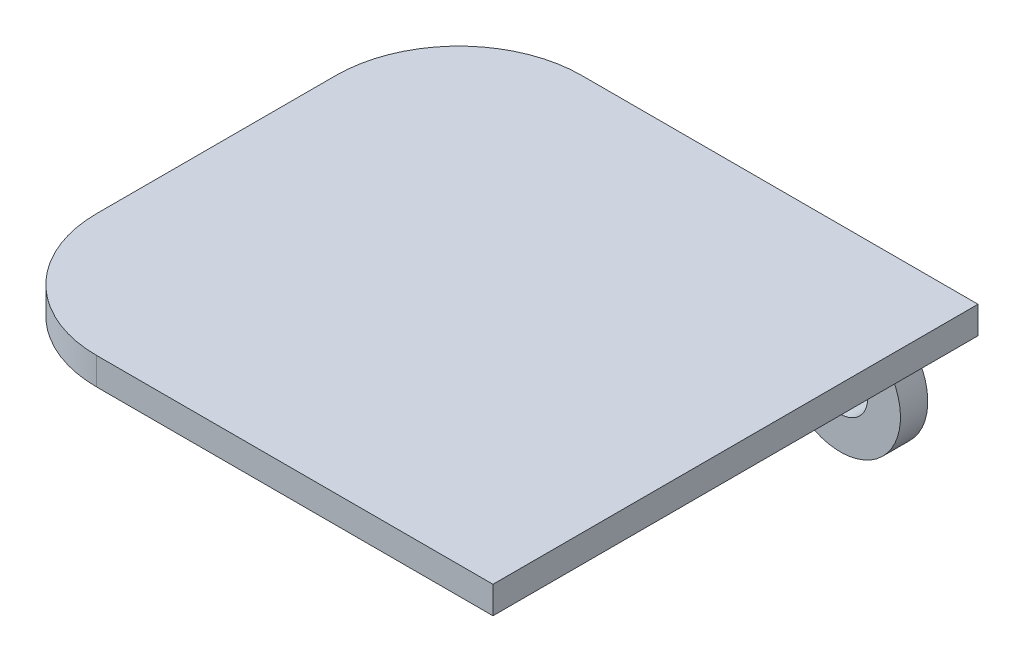
ISO-10303-21;
HEADER;
FILE_DESCRIPTION(('STEP AP214'),'2;1');
FILE_NAME('part.step','',(''),(''),'','','');
FILE_SCHEMA(('AUTOMOTIVE_DESIGN { 1 0 10303 214 1 1 1 1 }'));
ENDSEC;
DATA;
#1=APPLICATION_CONTEXT('core data for automotive mechanical design processes');
#2=APPLICATION_PROTOCOL_DEFINITION('international standard','automotive_design',2000,#1);
#3=PRODUCT_CONTEXT('',#1,'mechanical');
#4=PRODUCT('Part','Part','',(#3));
#5=PRODUCT_RELATED_PRODUCT_CATEGORY('part','',(#4));
#6=PRODUCT_DEFINITION_FORMATION('','',#4);
#7=PRODUCT_DEFINITION_CONTEXT('part definition',#1,'design');
#8=PRODUCT_DEFINITION('design','',#6,#7);
#9=PRODUCT_DEFINITION_SHAPE('','',#8);
#10=(LENGTH_UNIT() NAMED_UNIT(*) SI_UNIT(.MILLI.,.METRE.));
#11=(NAMED_UNIT(*) PLANE_ANGLE_UNIT() SI_UNIT($,.RADIAN.));
#12=(NAMED_UNIT(*) SI_UNIT($,.STERADIAN.) SOLID_ANGLE_UNIT());
#13=UNCERTAINTY_MEASURE_WITH_UNIT(LENGTH_MEASURE(1.E-05),#10,'distance_accuracy_value','');
#14=(GEOMETRIC_REPRESENTATION_CONTEXT(3) GLOBAL_UNCERTAINTY_ASSIGNED_CONTEXT((#13)) GLOBAL_UNIT_ASSIGNED_CONTEXT((#10,
#11,#12)) REPRESENTATION_CONTEXT('',''));
#15=CARTESIAN_POINT('',(0.,0.,0.));
#16=DIRECTION('',(0.,0.,1.));
#17=DIRECTION('',(1.,0.,0.));
#18=AXIS2_PLACEMENT_3D('',#15,#16,#17);
#19=CARTESIAN_POINT('',(-10.,0.,8.74999999999999));
#20=DIRECTION('',(0.,1.,0.));
#21=DIRECTION('',(0.,0.,1.));
#22=AXIS2_PLACEMENT_3D('',#19,#20,#21);
#23=PLANE('',#22);
#24=DIRECTION('',(0.,0.,-1.));
#25=VECTOR('',#24,1.);
#26=CARTESIAN_POINT('',(-3.50000000000001,0.,-15.75));
#27=LINE('',#26,#25);
#28=CARTESIAN_POINT('',(-3.50000000000001,0.,-15.75));
#29=VERTEX_POINT('',#28);
#30=CARTESIAN_POINT('',(-3.50000000000001,0.,-17.75));
#31=VERTEX_POINT('',#30);
#32=EDGE_CURVE('E133',#29,#31,#27,.T.);
#33=ORIENTED_EDGE('',*,*,#32,.F.);
#34=DIRECTION('',(1.,0.,0.));
#35=VECTOR('',#34,1.);
#36=CARTESIAN_POINT('',(10.5,0.,-15.75));
#37=LINE('',#36,#35);
#38=CARTESIAN_POINT('',(10.5,0.,-15.75));
#39=VERTEX_POINT('',#38);
#40=EDGE_CURVE('E174',#29,#39,#37,.T.);
#41=ORIENTED_EDGE('',*,*,#40,.T.);
#42=DIRECTION('',(0.,0.,-1.));
#43=VECTOR('',#42,1.);
#44=CARTESIAN_POINT('',(10.5,0.,-15.75));
#45=LINE('',#44,#43);
#46=CARTESIAN_POINT('',(10.5,0.,-17.75));
#47=VERTEX_POINT('',#46);
#48=EDGE_CURVE('E161',#39,#47,#45,.T.);
#49=ORIENTED_EDGE('',*,*,#48,.T.);
#50=DIRECTION('',(-1.,0.,0.));
#51=VECTOR('',#50,1.);
#52=CARTESIAN_POINT('',(-10.,0.,-17.75));
#53=LINE('',#52,#51);
#54=CARTESIAN_POINT('',(19.,0.,-17.75));
#55=VERTEX_POINT('',#54);
#56=EDGE_CURVE('E134',#55,#47,#53,.T.);
#57=ORIENTED_EDGE('',*,*,#56,.F.);
#58=DIRECTION('',(0.,0.,-1.));
#59=VECTOR('',#58,1.);
#60=CARTESIAN_POINT('',(19.,0.,-17.75));
#61=LINE('',#60,#59);
#62=CARTESIAN_POINT('',(19.,0.,17.75));
#63=VERTEX_POINT('',#62);
#64=EDGE_CURVE('E129',#63,#55,#61,.T.);
#65=ORIENTED_EDGE('',*,*,#64,.F.);
#66=DIRECTION('',(1.,0.,0.));
#67=VECTOR('',#66,1.);
#68=CARTESIAN_POINT('',(-9.99999999999999,0.,17.75));
#69=LINE('',#68,#67);
#70=CARTESIAN_POINT('',(-9.99999999999999,0.,17.75));
#71=VERTEX_POINT('',#70);
#72=EDGE_CURVE('E83',#71,#63,#69,.T.);
#73=ORIENTED_EDGE('',*,*,#72,.F.);
#74=CARTESIAN_POINT('',(-10.,0.,8.74999999999999));
#75=DIRECTION('',(0.,1.,0.));
#76=DIRECTION('',(0.,0.,1.));
#77=AXIS2_PLACEMENT_3D('',#74,#75,#76);
#78=CIRCLE('',#77,9.);
#79=CARTESIAN_POINT('',(-19.,0.,8.74999999999999));
#80=VERTEX_POINT('',#79);
#81=EDGE_CURVE('E140',#80,#71,#78,.T.);
#82=ORIENTED_EDGE('',*,*,#81,.F.);
#83=DIRECTION('',(0.,0.,1.));
#84=VECTOR('',#83,1.);
#85=CARTESIAN_POINT('',(-19.,0.,-8.75));
#86=LINE('',#85,#84);
#87=CARTESIAN_POINT('',(-19.,0.,-8.75));
#88=VERTEX_POINT('',#87);
#89=EDGE_CURVE('E117',#88,#80,#86,.T.);
#90=ORIENTED_EDGE('',*,*,#89,.F.);
#91=CARTESIAN_POINT('',(-10.,0.,-8.75));
#92=DIRECTION('',(0.,1.,0.));
#93=DIRECTION('',(0.,0.,1.));
#94=AXIS2_PLACEMENT_3D('',#91,#92,#93);
#95=CIRCLE('',#94,9.);
#96=CARTESIAN_POINT('',(-10.,0.,-17.75));
#97=VERTEX_POINT('',#96);
#98=EDGE_CURVE('E137',#97,#88,#95,.T.);
#99=ORIENTED_EDGE('',*,*,#98,.F.);
#100=EDGE_CURVE('E132',#31,#97,#53,.T.);
#101=ORIENTED_EDGE('',*,*,#100,.F.);
#102=EDGE_LOOP('',(#33,#41,#49,#57,#65,#73,#82,#90,#99,#101));
#103=FACE_BOUND('',#102,.T.);
#104=ADVANCED_FACE('F32',(#103),#23,.F.);
#105=CARTESIAN_POINT('',(19.,2.,-17.75));
#106=DIRECTION('',(-1.,0.,0.));
#107=DIRECTION('',(0.,0.,1.));
#108=AXIS2_PLACEMENT_3D('',#105,#106,#107);
#109=PLANE('',#108);
#110=ORIENTED_EDGE('',*,*,#64,.T.);
#111=DIRECTION('',(0.,-1.,0.));
#112=VECTOR('',#111,1.);
#113=CARTESIAN_POINT('',(19.,2.,-17.75));
#114=LINE('',#113,#112);
#115=CARTESIAN_POINT('',(19.,2.,-17.75));
#116=VERTEX_POINT('',#115);
#117=EDGE_CURVE('E11',#116,#55,#114,.T.);
#118=ORIENTED_EDGE('',*,*,#117,.F.);
#119=DIRECTION('',(0.,0.,-1.));
#120=VECTOR('',#119,1.);
#121=CARTESIAN_POINT('',(19.,2.,-17.75));
#122=LINE('',#121,#120);
#123=CARTESIAN_POINT('',(19.,2.,17.75));
#124=VERTEX_POINT('',#123);
#125=EDGE_CURVE('E143',#124,#116,#122,.T.);
#126=ORIENTED_EDGE('',*,*,#125,.F.);
#127=DIRECTION('',(0.,-1.,0.));
#128=VECTOR('',#127,1.);
#129=CARTESIAN_POINT('',(19.,2.,17.75));
#130=LINE('',#129,#128);
#131=EDGE_CURVE('E125',#124,#63,#130,.T.);
#132=ORIENTED_EDGE('',*,*,#131,.T.);
#133=EDGE_LOOP('',(#110,#118,#126,#132));
#134=FACE_BOUND('',#133,.T.);
#135=ADVANCED_FACE('F34',(#134),#109,.F.);
#136=CARTESIAN_POINT('',(-10.,2.,-17.75));
#137=DIRECTION('',(0.,0.,1.));
#138=DIRECTION('',(1.,0.,0.));
#139=AXIS2_PLACEMENT_3D('',#136,#137,#138);
#140=PLANE('',#139);
#141=ORIENTED_EDGE('',*,*,#56,.T.);
#142=DIRECTION('',(0.777751862218068,-0.628571428571429,0.));
#143=VECTOR('',#142,1.);
#144=CARTESIAN_POINT('',(10.5,0.,-17.75));
#145=LINE('',#144,#143);
#146=CARTESIAN_POINT('',(13.6897093341595,-2.5778918062405,-17.75));
#147=VERTEX_POINT('',#146);
#148=EDGE_CURVE('E47',#47,#147,#145,.T.);
#149=ORIENTED_EDGE('',*,*,#148,.T.);
#150=CARTESIAN_POINT('',(10.9239950484452,-6.,-17.75));
#151=DIRECTION('',(0.,0.,-1.));
#152=DIRECTION('',(1.,0.,0.));
#153=AXIS2_PLACEMENT_3D('',#150,#151,#152);
#154=CIRCLE('',#153,4.4);
#155=CARTESIAN_POINT('',(8.1582807627309,-9.4221081937595,-17.75));
#156=VERTEX_POINT('',#155);
#157=EDGE_CURVE('E175',#147,#156,#154,.T.);
#158=ORIENTED_EDGE('',*,*,#157,.T.);
#159=DIRECTION('',(-0.777751862218068,0.628571428571429,0.));
#160=VECTOR('',#159,1.);
#161=CARTESIAN_POINT('',(8.1582807627309,-9.4221081937595,-17.75));
#162=LINE('',#161,#160);
#163=EDGE_CURVE('E171',#156,#31,#162,.T.);
#164=ORIENTED_EDGE('',*,*,#163,.T.);
#165=ORIENTED_EDGE('',*,*,#100,.T.);
#166=DIRECTION('',(0.,-1.,0.));
#167=VECTOR('',#166,1.);
#168=CARTESIAN_POINT('',(-10.,2.,-17.75));
#169=LINE('',#168,#167);
#170=CARTESIAN_POINT('',(-10.,2.,-17.75));
#171=VERTEX_POINT('',#170);
#172=EDGE_CURVE('E40',#171,#97,#169,.T.);
#173=ORIENTED_EDGE('',*,*,#172,.F.);
#174=DIRECTION('',(-1.,0.,0.));
#175=VECTOR('',#174,1.);
#176=CARTESIAN_POINT('',(-10.,2.,-17.75));
#177=LINE('',#176,#175);
#178=EDGE_CURVE('E91',#116,#171,#177,.T.);
#179=ORIENTED_EDGE('',*,*,#178,.F.);
#180=ORIENTED_EDGE('',*,*,#117,.T.);
#181=EDGE_LOOP('',(#141,#149,#158,#164,#165,#173,#179,#180));
#182=FACE_BOUND('',#181,.T.);
#183=CARTESIAN_POINT('',(10.9239950484452,-6.,-17.75));
#184=DIRECTION('',(0.,0.,-1.));
#185=DIRECTION('',(-1.,0.,0.));
#186=AXIS2_PLACEMENT_3D('',#183,#184,#185);
#187=CIRCLE('',#186,2.);
#188=CARTESIAN_POINT('',(8.92399504844518,-6.,-17.75));
#189=VERTEX_POINT('',#188);
#190=EDGE_CURVE('E190',#189,#189,#187,.T.);
#191=ORIENTED_EDGE('',*,*,#190,.F.);
#192=EDGE_LOOP('',(#191));
#193=FACE_BOUND('',#192,.T.);
#194=ADVANCED_FACE('F205',(#182,#193),#140,.F.);
#195=CARTESIAN_POINT('',(-10.,2.,-8.75));
#196=DIRECTION('',(0.,-1.,0.));
#197=DIRECTION('',(0.,0.,-1.));
#198=AXIS2_PLACEMENT_3D('',#195,#196,#197);
#199=CYLINDRICAL_SURFACE('',#198,9.);
#200=ORIENTED_EDGE('',*,*,#98,.T.);
#201=DIRECTION('',(0.,-1.,0.));
#202=VECTOR('',#201,1.);
#203=CARTESIAN_POINT('',(-19.,2.,-8.75));
#204=LINE('',#203,#202);
#205=CARTESIAN_POINT('',(-19.,2.,-8.75));
#206=VERTEX_POINT('',#205);
#207=EDGE_CURVE('E120',#206,#88,#204,.T.);
#208=ORIENTED_EDGE('',*,*,#207,.F.);
#209=CARTESIAN_POINT('',(-10.,2.,-8.75));
#210=DIRECTION('',(0.,1.,0.));
#211=DIRECTION('',(0.,0.,1.));
#212=AXIS2_PLACEMENT_3D('',#209,#210,#211);
#213=CIRCLE('',#212,9.);
#214=EDGE_CURVE('E108',#171,#206,#213,.T.);
#215=ORIENTED_EDGE('',*,*,#214,.F.);
#216=ORIENTED_EDGE('',*,*,#172,.T.);
#217=EDGE_LOOP('',(#200,#208,#215,#216));
#218=FACE_BOUND('',#217,.T.);
#219=ADVANCED_FACE('F149',(#218),#199,.T.);
#220=CARTESIAN_POINT('',(-19.,2.,-8.75));
#221=DIRECTION('',(1.,0.,0.));
#222=DIRECTION('',(0.,0.,-1.));
#223=AXIS2_PLACEMENT_3D('',#220,#221,#222);
#224=PLANE('',#223);
#225=ORIENTED_EDGE('',*,*,#89,.T.);
#226=DIRECTION('',(0.,-1.,0.));
#227=VECTOR('',#226,1.);
#228=CARTESIAN_POINT('',(-19.,2.,8.74999999999999));
#229=LINE('',#228,#227);
#230=CARTESIAN_POINT('',(-19.,2.,8.74999999999999));
#231=VERTEX_POINT('',#230);
#232=EDGE_CURVE('E114',#231,#80,#229,.T.);
#233=ORIENTED_EDGE('',*,*,#232,.F.);
#234=DIRECTION('',(0.,0.,1.));
#235=VECTOR('',#234,1.);
#236=CARTESIAN_POINT('',(-19.,2.,-8.75));
#237=LINE('',#236,#235);
#238=EDGE_CURVE('E101',#206,#231,#237,.T.);
#239=ORIENTED_EDGE('',*,*,#238,.F.);
#240=ORIENTED_EDGE('',*,*,#207,.T.);
#241=EDGE_LOOP('',(#225,#233,#239,#240));
#242=FACE_BOUND('',#241,.T.);
#243=ADVANCED_FACE('F115',(#242),#224,.F.);
#244=CARTESIAN_POINT('',(-10.,2.,8.74999999999999));
#245=DIRECTION('',(0.,-1.,0.));
#246=DIRECTION('',(0.,0.,-1.));
#247=AXIS2_PLACEMENT_3D('',#244,#245,#246);
#248=CYLINDRICAL_SURFACE('',#247,9.);
#249=ORIENTED_EDGE('',*,*,#81,.T.);
#250=DIRECTION('',(0.,-1.,0.));
#251=VECTOR('',#250,1.);
#252=CARTESIAN_POINT('',(-9.99999999999999,2.,17.75));
#253=LINE('',#252,#251);
#254=CARTESIAN_POINT('',(-9.99999999999999,2.,17.75));
#255=VERTEX_POINT('',#254);
#256=EDGE_CURVE('E121',#255,#71,#253,.T.);
#257=ORIENTED_EDGE('',*,*,#256,.F.);
#258=CARTESIAN_POINT('',(-10.,2.,8.74999999999999));
#259=DIRECTION('',(0.,1.,0.));
#260=DIRECTION('',(0.,0.,1.));
#261=AXIS2_PLACEMENT_3D('',#258,#259,#260);
#262=CIRCLE('',#261,9.);
#263=EDGE_CURVE('E105',#231,#255,#262,.T.);
#264=ORIENTED_EDGE('',*,*,#263,.F.);
#265=ORIENTED_EDGE('',*,*,#232,.T.);
#266=EDGE_LOOP('',(#249,#257,#264,#265));
#267=FACE_BOUND('',#266,.T.);
#268=ADVANCED_FACE('F123',(#267),#248,.T.);
#269=CARTESIAN_POINT('',(-9.99999999999999,2.,17.75));
#270=DIRECTION('',(0.,0.,-1.));
#271=DIRECTION('',(-1.,0.,0.));
#272=AXIS2_PLACEMENT_3D('',#269,#270,#271);
#273=PLANE('',#272);
#274=ORIENTED_EDGE('',*,*,#72,.T.);
#275=ORIENTED_EDGE('',*,*,#131,.F.);
#276=DIRECTION('',(1.,0.,0.));
#277=VECTOR('',#276,1.);
#278=CARTESIAN_POINT('',(-9.99999999999999,2.,17.75));
#279=LINE('',#278,#277);
#280=EDGE_CURVE('E56',#255,#124,#279,.T.);
#281=ORIENTED_EDGE('',*,*,#280,.F.);
#282=ORIENTED_EDGE('',*,*,#256,.T.);
#283=EDGE_LOOP('',(#274,#275,#281,#282));
#284=FACE_BOUND('',#283,.T.);
#285=ADVANCED_FACE('F154',(#284),#273,.F.);
#286=CARTESIAN_POINT('',(-10.,2.,8.74999999999999));
#287=DIRECTION('',(0.,1.,0.));
#288=DIRECTION('',(0.,0.,1.));
#289=AXIS2_PLACEMENT_3D('',#286,#287,#288);
#290=PLANE('',#289);
#291=ORIENTED_EDGE('',*,*,#125,.T.);
#292=ORIENTED_EDGE('',*,*,#178,.T.);
#293=ORIENTED_EDGE('',*,*,#214,.T.);
#294=ORIENTED_EDGE('',*,*,#238,.T.);
#295=ORIENTED_EDGE('',*,*,#263,.T.);
#296=ORIENTED_EDGE('',*,*,#280,.T.);
#297=EDGE_LOOP('',(#291,#292,#293,#294,#295,#296));
#298=FACE_BOUND('',#297,.T.);
#299=ADVANCED_FACE('F103',(#298),#290,.T.);
#300=CARTESIAN_POINT('',(8.1582807627309,-9.4221081937595,-15.75));
#301=DIRECTION('',(-0.628571428571429,-0.777751862218068,0.));
#302=DIRECTION('',(0.777751862218068,-0.628571428571429,0.));
#303=AXIS2_PLACEMENT_3D('',#300,#301,#302);
#304=PLANE('',#303);
#305=ORIENTED_EDGE('',*,*,#163,.F.);
#306=DIRECTION('',(0.,0.,-1.));
#307=VECTOR('',#306,1.);
#308=CARTESIAN_POINT('',(8.1582807627309,-9.4221081937595,-15.75));
#309=LINE('',#308,#307);
#310=CARTESIAN_POINT('',(8.1582807627309,-9.4221081937595,-15.75));
#311=VERTEX_POINT('',#310);
#312=EDGE_CURVE('E166',#311,#156,#309,.T.);
#313=ORIENTED_EDGE('',*,*,#312,.F.);
#314=DIRECTION('',(-0.777751862218068,0.628571428571429,0.));
#315=VECTOR('',#314,1.);
#316=CARTESIAN_POINT('',(8.1582807627309,-9.4221081937595,-15.75));
#317=LINE('',#316,#315);
#318=EDGE_CURVE('E164',#311,#29,#317,.T.);
#319=ORIENTED_EDGE('',*,*,#318,.T.);
#320=ORIENTED_EDGE('',*,*,#32,.T.);
#321=EDGE_LOOP('',(#305,#313,#319,#320));
#322=FACE_BOUND('',#321,.T.);
#323=ADVANCED_FACE('F242',(#322),#304,.T.);
#324=CARTESIAN_POINT('',(10.9239950484452,-6.,-15.75));
#325=DIRECTION('',(0.,0.,-1.));
#326=DIRECTION('',(-1.,0.,0.));
#327=AXIS2_PLACEMENT_3D('',#324,#325,#326);
#328=CYLINDRICAL_SURFACE('',#327,4.4);
#329=ORIENTED_EDGE('',*,*,#157,.F.);
#330=DIRECTION('',(0.,0.,-1.));
#331=VECTOR('',#330,1.);
#332=CARTESIAN_POINT('',(13.6897093341595,-2.5778918062405,-15.75));
#333=LINE('',#332,#331);
#334=CARTESIAN_POINT('',(13.6897093341595,-2.5778918062405,-15.75));
#335=VERTEX_POINT('',#334);
#336=EDGE_CURVE('E163',#335,#147,#333,.T.);
#337=ORIENTED_EDGE('',*,*,#336,.F.);
#338=CARTESIAN_POINT('',(10.9239950484452,-6.,-15.75));
#339=DIRECTION('',(0.,0.,-1.));
#340=DIRECTION('',(1.,0.,0.));
#341=AXIS2_PLACEMENT_3D('',#338,#339,#340);
#342=CIRCLE('',#341,4.4);
#343=EDGE_CURVE('E182',#335,#311,#342,.T.);
#344=ORIENTED_EDGE('',*,*,#343,.T.);
#345=ORIENTED_EDGE('',*,*,#312,.T.);
#346=EDGE_LOOP('',(#329,#337,#344,#345));
#347=FACE_BOUND('',#346,.T.);
#348=ADVANCED_FACE('F248',(#347),#328,.T.);
#349=CARTESIAN_POINT('',(10.5,0.,-15.75));
#350=DIRECTION('',(0.628571428571429,0.777751862218068,0.));
#351=DIRECTION('',(-0.777751862218068,0.628571428571429,0.));
#352=AXIS2_PLACEMENT_3D('',#349,#350,#351);
#353=PLANE('',#352);
#354=ORIENTED_EDGE('',*,*,#148,.F.);
#355=ORIENTED_EDGE('',*,*,#48,.F.);
#356=DIRECTION('',(0.777751862218068,-0.628571428571429,0.));
#357=VECTOR('',#356,1.);
#358=CARTESIAN_POINT('',(10.5,0.,-15.75));
#359=LINE('',#358,#357);
#360=EDGE_CURVE('E185',#39,#335,#359,.T.);
#361=ORIENTED_EDGE('',*,*,#360,.T.);
#362=ORIENTED_EDGE('',*,*,#336,.T.);
#363=EDGE_LOOP('',(#354,#355,#361,#362));
#364=FACE_BOUND('',#363,.T.);
#365=ADVANCED_FACE('F256',(#364),#353,.T.);
#366=CARTESIAN_POINT('',(10.9239950484452,-6.,-15.75));
#367=DIRECTION('',(0.,0.,1.));
#368=DIRECTION('',(1.,0.,0.));
#369=AXIS2_PLACEMENT_3D('',#366,#367,#368);
#370=PLANE('',#369);
#371=CARTESIAN_POINT('',(10.9239950484452,-6.,-15.75));
#372=DIRECTION('',(0.,0.,-1.));
#373=DIRECTION('',(-1.,0.,0.));
#374=AXIS2_PLACEMENT_3D('',#371,#372,#373);
#375=CIRCLE('',#374,2.);
#376=CARTESIAN_POINT('',(8.92399504844518,-6.,-15.75));
#377=VERTEX_POINT('',#376);
#378=EDGE_CURVE('E179',#377,#377,#375,.T.);
#379=ORIENTED_EDGE('',*,*,#378,.T.);
#380=EDGE_LOOP('',(#379));
#381=FACE_BOUND('',#380,.T.);
#382=ORIENTED_EDGE('',*,*,#40,.F.);
#383=ORIENTED_EDGE('',*,*,#318,.F.);
#384=ORIENTED_EDGE('',*,*,#343,.F.);
#385=ORIENTED_EDGE('',*,*,#360,.F.);
#386=EDGE_LOOP('',(#382,#383,#384,#385));
#387=FACE_BOUND('',#386,.T.);
#388=ADVANCED_FACE('F196',(#381,#387),#370,.T.);
#389=CARTESIAN_POINT('',(10.9239950484452,-6.,-15.75));
#390=DIRECTION('',(0.,0.,-1.));
#391=DIRECTION('',(-1.,0.,0.));
#392=AXIS2_PLACEMENT_3D('',#389,#390,#391);
#393=CYLINDRICAL_SURFACE('',#392,2.);
#394=ORIENTED_EDGE('',*,*,#378,.F.);
#395=EDGE_LOOP('',(#394));
#396=FACE_BOUND('',#395,.T.);
#397=ORIENTED_EDGE('',*,*,#190,.T.);
#398=EDGE_LOOP('',(#397));
#399=FACE_BOUND('',#398,.T.);
#400=ADVANCED_FACE('F199',(#396,#399),#393,.F.);
#401=CLOSED_SHELL('',(#104,#135,#194,#219,#243,#268,#285,#299,#323,#348,#365,#388,#400));
#402=MANIFOLD_SOLID_BREP('B2',#401);
#403=ADVANCED_BREP_SHAPE_REPRESENTATION('',(#18,#402),#14);
#404=SHAPE_DEFINITION_REPRESENTATION(#9,#403);
ENDSEC;
END-ISO-10303-21;
